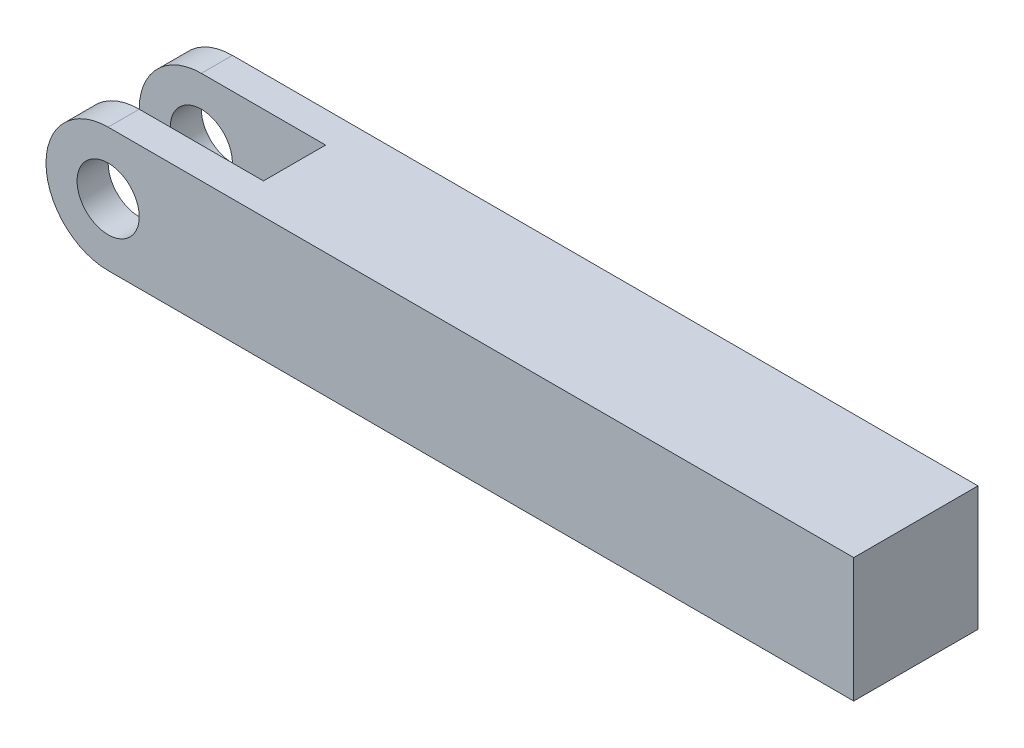
ISO-10303-21;
HEADER;
FILE_DESCRIPTION(('STEP AP214'),'2;1');
FILE_NAME('part.step','',(''),(''),'','','');
FILE_SCHEMA(('AUTOMOTIVE_DESIGN { 1 0 10303 214 1 1 1 1 }'));
ENDSEC;
DATA;
#1=APPLICATION_CONTEXT('core data for automotive mechanical design processes');
#2=APPLICATION_PROTOCOL_DEFINITION('international standard','automotive_design',2000,#1);
#3=PRODUCT_CONTEXT('',#1,'mechanical');
#4=PRODUCT('Part','Part','',(#3));
#5=PRODUCT_RELATED_PRODUCT_CATEGORY('part','',(#4));
#6=PRODUCT_DEFINITION_FORMATION('','',#4);
#7=PRODUCT_DEFINITION_CONTEXT('part definition',#1,'design');
#8=PRODUCT_DEFINITION('design','',#6,#7);
#9=PRODUCT_DEFINITION_SHAPE('','',#8);
#10=(LENGTH_UNIT() NAMED_UNIT(*) SI_UNIT(.MILLI.,.METRE.));
#11=(NAMED_UNIT(*) PLANE_ANGLE_UNIT() SI_UNIT($,.RADIAN.));
#12=(NAMED_UNIT(*) SI_UNIT($,.STERADIAN.) SOLID_ANGLE_UNIT());
#13=UNCERTAINTY_MEASURE_WITH_UNIT(LENGTH_MEASURE(1.E-05),#10,'distance_accuracy_value','');
#14=(GEOMETRIC_REPRESENTATION_CONTEXT(3) GLOBAL_UNCERTAINTY_ASSIGNED_CONTEXT((#13)) GLOBAL_UNIT_ASSIGNED_CONTEXT((#10,
#11,#12)) REPRESENTATION_CONTEXT('',''));
#15=CARTESIAN_POINT('',(0.,0.,0.));
#16=DIRECTION('',(0.,0.,1.));
#17=DIRECTION('',(1.,0.,0.));
#18=AXIS2_PLACEMENT_3D('',#15,#16,#17);
#19=CARTESIAN_POINT('',(-25.,-5.,5.));
#20=DIRECTION('',(1.,0.,0.));
#21=DIRECTION('',(0.,0.,-1.));
#22=AXIS2_PLACEMENT_3D('',#19,#20,#21);
#23=PLANE('',#22);
#24=DIRECTION('',(0.,-1.,0.));
#25=VECTOR('',#24,1.);
#26=CARTESIAN_POINT('',(-25.,-5.,2.5));
#27=LINE('',#26,#25);
#28=CARTESIAN_POINT('',(-25.,5.,2.5));
#29=VERTEX_POINT('',#28);
#30=CARTESIAN_POINT('',(-25.,-5.,2.5));
#31=VERTEX_POINT('',#30);
#32=EDGE_CURVE('E119',#29,#31,#27,.T.);
#33=ORIENTED_EDGE('',*,*,#32,.F.);
#34=DIRECTION('',(0.,0.,-1.));
#35=VECTOR('',#34,1.);
#36=CARTESIAN_POINT('',(-25.,5.,5.));
#37=LINE('',#36,#35);
#38=CARTESIAN_POINT('',(-25.,5.,-2.5));
#39=VERTEX_POINT('',#38);
#40=EDGE_CURVE('E50',#29,#39,#37,.T.);
#41=ORIENTED_EDGE('',*,*,#40,.T.);
#42=DIRECTION('',(0.,-1.,0.));
#43=VECTOR('',#42,1.);
#44=CARTESIAN_POINT('',(-25.,-5.,-2.5));
#45=LINE('',#44,#43);
#46=CARTESIAN_POINT('',(-25.,-5.,-2.5));
#47=VERTEX_POINT('',#46);
#48=EDGE_CURVE('E116',#39,#47,#45,.T.);
#49=ORIENTED_EDGE('',*,*,#48,.T.);
#50=DIRECTION('',(0.,0.,-1.));
#51=VECTOR('',#50,1.);
#52=CARTESIAN_POINT('',(-25.,-5.,5.));
#53=LINE('',#52,#51);
#54=EDGE_CURVE('E57',#31,#47,#53,.T.);
#55=ORIENTED_EDGE('',*,*,#54,.F.);
#56=EDGE_LOOP('',(#33,#41,#49,#55));
#57=FACE_BOUND('',#56,.T.);
#58=ADVANCED_FACE('F42',(#57),#23,.F.);
#59=CARTESIAN_POINT('',(25.,-5.,5.));
#60=DIRECTION('',(-1.,0.,0.));
#61=DIRECTION('',(0.,0.,1.));
#62=AXIS2_PLACEMENT_3D('',#59,#60,#61);
#63=PLANE('',#62);
#64=DIRECTION('',(0.,1.,0.));
#65=VECTOR('',#64,1.);
#66=CARTESIAN_POINT('',(25.,-5.,-5.));
#67=LINE('',#66,#65);
#68=CARTESIAN_POINT('',(25.,-5.,-5.));
#69=VERTEX_POINT('',#68);
#70=CARTESIAN_POINT('',(25.,5.,-5.));
#71=VERTEX_POINT('',#70);
#72=EDGE_CURVE('E97',#69,#71,#67,.T.);
#73=ORIENTED_EDGE('',*,*,#72,.T.);
#74=DIRECTION('',(0.,0.,-1.));
#75=VECTOR('',#74,1.);
#76=CARTESIAN_POINT('',(25.,5.,5.));
#77=LINE('',#76,#75);
#78=CARTESIAN_POINT('',(25.,5.,5.));
#79=VERTEX_POINT('',#78);
#80=EDGE_CURVE('E11',#79,#71,#77,.T.);
#81=ORIENTED_EDGE('',*,*,#80,.F.);
#82=DIRECTION('',(0.,1.,0.));
#83=VECTOR('',#82,1.);
#84=CARTESIAN_POINT('',(25.,-5.,5.));
#85=LINE('',#84,#83);
#86=CARTESIAN_POINT('',(25.,-5.,5.));
#87=VERTEX_POINT('',#86);
#88=EDGE_CURVE('E91',#87,#79,#85,.T.);
#89=ORIENTED_EDGE('',*,*,#88,.F.);
#90=DIRECTION('',(0.,0.,-1.));
#91=VECTOR('',#90,1.);
#92=CARTESIAN_POINT('',(25.,-5.,5.));
#93=LINE('',#92,#91);
#94=EDGE_CURVE('E82',#87,#69,#93,.T.);
#95=ORIENTED_EDGE('',*,*,#94,.T.);
#96=EDGE_LOOP('',(#73,#81,#89,#95));
#97=FACE_BOUND('',#96,.T.);
#98=ADVANCED_FACE('F44',(#97),#63,.F.);
#99=CARTESIAN_POINT('',(-25.,5.,5.));
#100=DIRECTION('',(0.,-1.,0.));
#101=DIRECTION('',(0.,0.,-1.));
#102=AXIS2_PLACEMENT_3D('',#99,#100,#101);
#103=PLANE('',#102);
#104=DIRECTION('',(-1.,0.,0.));
#105=VECTOR('',#104,1.);
#106=CARTESIAN_POINT('',(-25.,5.,-5.));
#107=LINE('',#106,#105);
#108=CARTESIAN_POINT('',(-35.,5.,-5.));
#109=VERTEX_POINT('',#108);
#110=EDGE_CURVE('E92',#71,#109,#107,.T.);
#111=ORIENTED_EDGE('',*,*,#110,.T.);
#112=DIRECTION('',(0.,0.,-1.));
#113=VECTOR('',#112,1.);
#114=CARTESIAN_POINT('',(-35.,5.,-2.5));
#115=LINE('',#114,#113);
#116=CARTESIAN_POINT('',(-35.,5.,-2.5));
#117=VERTEX_POINT('',#116);
#118=EDGE_CURVE('E102',#117,#109,#115,.T.);
#119=ORIENTED_EDGE('',*,*,#118,.F.);
#120=DIRECTION('',(1.,0.,0.));
#121=VECTOR('',#120,1.);
#122=CARTESIAN_POINT('',(-25.,5.,-2.5));
#123=LINE('',#122,#121);
#124=EDGE_CURVE('E129',#117,#39,#123,.T.);
#125=ORIENTED_EDGE('',*,*,#124,.T.);
#126=ORIENTED_EDGE('',*,*,#40,.F.);
#127=DIRECTION('',(1.,0.,0.));
#128=VECTOR('',#127,1.);
#129=CARTESIAN_POINT('',(-25.,5.,2.5));
#130=LINE('',#129,#128);
#131=CARTESIAN_POINT('',(-35.,5.,2.5));
#132=VERTEX_POINT('',#131);
#133=EDGE_CURVE('E166',#132,#29,#130,.T.);
#134=ORIENTED_EDGE('',*,*,#133,.F.);
#135=DIRECTION('',(0.,0.,1.));
#136=VECTOR('',#135,1.);
#137=CARTESIAN_POINT('',(-35.,5.,2.5));
#138=LINE('',#137,#136);
#139=CARTESIAN_POINT('',(-35.,5.,5.));
#140=VERTEX_POINT('',#139);
#141=EDGE_CURVE('E160',#132,#140,#138,.T.);
#142=ORIENTED_EDGE('',*,*,#141,.T.);
#143=DIRECTION('',(-1.,0.,0.));
#144=VECTOR('',#143,1.);
#145=CARTESIAN_POINT('',(-25.,5.,5.));
#146=LINE('',#145,#144);
#147=EDGE_CURVE('E144',#79,#140,#146,.T.);
#148=ORIENTED_EDGE('',*,*,#147,.F.);
#149=ORIENTED_EDGE('',*,*,#80,.T.);
#150=EDGE_LOOP('',(#111,#119,#125,#126,#134,#142,#148,#149));
#151=FACE_BOUND('',#150,.T.);
#152=ADVANCED_FACE('F134',(#151),#103,.F.);
#153=CARTESIAN_POINT('',(-25.,-5.,5.));
#154=DIRECTION('',(0.,1.,0.));
#155=DIRECTION('',(0.,0.,1.));
#156=AXIS2_PLACEMENT_3D('',#153,#154,#155);
#157=PLANE('',#156);
#158=DIRECTION('',(1.,0.,0.));
#159=VECTOR('',#158,1.);
#160=CARTESIAN_POINT('',(-25.,-5.,-5.));
#161=LINE('',#160,#159);
#162=CARTESIAN_POINT('',(-35.,-5.,-5.));
#163=VERTEX_POINT('',#162);
#164=EDGE_CURVE('E79',#163,#69,#161,.T.);
#165=ORIENTED_EDGE('',*,*,#164,.T.);
#166=ORIENTED_EDGE('',*,*,#94,.F.);
#167=DIRECTION('',(1.,0.,0.));
#168=VECTOR('',#167,1.);
#169=CARTESIAN_POINT('',(-25.,-5.,5.));
#170=LINE('',#169,#168);
#171=CARTESIAN_POINT('',(-35.,-5.,5.));
#172=VERTEX_POINT('',#171);
#173=EDGE_CURVE('E66',#172,#87,#170,.T.);
#174=ORIENTED_EDGE('',*,*,#173,.F.);
#175=DIRECTION('',(0.,0.,1.));
#176=VECTOR('',#175,1.);
#177=CARTESIAN_POINT('',(-35.,-5.,2.5));
#178=LINE('',#177,#176);
#179=CARTESIAN_POINT('',(-35.,-5.,2.5));
#180=VERTEX_POINT('',#179);
#181=EDGE_CURVE('E162',#180,#172,#178,.T.);
#182=ORIENTED_EDGE('',*,*,#181,.F.);
#183=DIRECTION('',(-1.,0.,0.));
#184=VECTOR('',#183,1.);
#185=CARTESIAN_POINT('',(-35.,-5.,2.5));
#186=LINE('',#185,#184);
#187=EDGE_CURVE('E167',#31,#180,#186,.T.);
#188=ORIENTED_EDGE('',*,*,#187,.F.);
#189=ORIENTED_EDGE('',*,*,#54,.T.);
#190=DIRECTION('',(-1.,0.,0.));
#191=VECTOR('',#190,1.);
#192=CARTESIAN_POINT('',(-35.,-5.,-2.5));
#193=LINE('',#192,#191);
#194=CARTESIAN_POINT('',(-35.,-5.,-2.5));
#195=VERTEX_POINT('',#194);
#196=EDGE_CURVE('E130',#47,#195,#193,.T.);
#197=ORIENTED_EDGE('',*,*,#196,.T.);
#198=DIRECTION('',(0.,0.,-1.));
#199=VECTOR('',#198,1.);
#200=CARTESIAN_POINT('',(-35.,-5.,-2.5));
#201=LINE('',#200,#199);
#202=EDGE_CURVE('E86',#195,#163,#201,.T.);
#203=ORIENTED_EDGE('',*,*,#202,.T.);
#204=EDGE_LOOP('',(#165,#166,#174,#182,#188,#189,#197,#203));
#205=FACE_BOUND('',#204,.T.);
#206=ADVANCED_FACE('F81',(#205),#157,.F.);
#207=CARTESIAN_POINT('',(0.,0.,5.));
#208=DIRECTION('',(0.,0.,-1.));
#209=DIRECTION('',(-1.,0.,0.));
#210=AXIS2_PLACEMENT_3D('',#207,#208,#209);
#211=PLANE('',#210);
#212=ORIENTED_EDGE('',*,*,#88,.T.);
#213=ORIENTED_EDGE('',*,*,#147,.T.);
#214=CARTESIAN_POINT('',(-35.,0.,5.));
#215=DIRECTION('',(0.,0.,-1.));
#216=DIRECTION('',(-1.,0.,0.));
#217=AXIS2_PLACEMENT_3D('',#214,#215,#216);
#218=CIRCLE('',#217,5.);
#219=EDGE_CURVE('E151',#172,#140,#218,.T.);
#220=ORIENTED_EDGE('',*,*,#219,.F.);
#221=ORIENTED_EDGE('',*,*,#173,.T.);
#222=EDGE_LOOP('',(#212,#213,#220,#221));
#223=FACE_BOUND('',#222,.T.);
#224=CARTESIAN_POINT('',(-35.,0.,5.));
#225=DIRECTION('',(0.,0.,-1.));
#226=DIRECTION('',(-1.,0.,0.));
#227=AXIS2_PLACEMENT_3D('',#224,#225,#226);
#228=CIRCLE('',#227,2.49999999999999);
#229=CARTESIAN_POINT('',(-37.5,0.,5.));
#230=VERTEX_POINT('',#229);
#231=EDGE_CURVE('E197',#230,#230,#228,.T.);
#232=ORIENTED_EDGE('',*,*,#231,.T.);
#233=EDGE_LOOP('',(#232));
#234=FACE_BOUND('',#233,.T.);
#235=ADVANCED_FACE('F148',(#223,#234),#211,.F.);
#236=CARTESIAN_POINT('',(0.,0.,-5.));
#237=DIRECTION('',(0.,0.,-1.));
#238=DIRECTION('',(-1.,0.,0.));
#239=AXIS2_PLACEMENT_3D('',#236,#237,#238);
#240=PLANE('',#239);
#241=ORIENTED_EDGE('',*,*,#72,.F.);
#242=ORIENTED_EDGE('',*,*,#164,.F.);
#243=CARTESIAN_POINT('',(-35.,0.,-5.));
#244=DIRECTION('',(0.,0.,-1.));
#245=DIRECTION('',(-1.,0.,0.));
#246=AXIS2_PLACEMENT_3D('',#243,#244,#245);
#247=CIRCLE('',#246,5.);
#248=EDGE_CURVE('E131',#163,#109,#247,.T.);
#249=ORIENTED_EDGE('',*,*,#248,.T.);
#250=ORIENTED_EDGE('',*,*,#110,.F.);
#251=EDGE_LOOP('',(#241,#242,#249,#250));
#252=FACE_BOUND('',#251,.T.);
#253=CARTESIAN_POINT('',(-35.,0.,-5.));
#254=DIRECTION('',(0.,0.,-1.));
#255=DIRECTION('',(-1.,0.,0.));
#256=AXIS2_PLACEMENT_3D('',#253,#254,#255);
#257=CIRCLE('',#256,2.49999999999999);
#258=CARTESIAN_POINT('',(-37.5,0.,-5.));
#259=VERTEX_POINT('',#258);
#260=EDGE_CURVE('E169',#259,#259,#257,.T.);
#261=ORIENTED_EDGE('',*,*,#260,.F.);
#262=EDGE_LOOP('',(#261));
#263=FACE_BOUND('',#262,.T.);
#264=ADVANCED_FACE('F99',(#252,#263),#240,.T.);
#265=CARTESIAN_POINT('',(-35.,0.,-2.5));
#266=DIRECTION('',(0.,0.,-1.));
#267=DIRECTION('',(-1.,0.,0.));
#268=AXIS2_PLACEMENT_3D('',#265,#266,#267);
#269=CYLINDRICAL_SURFACE('',#268,5.);
#270=ORIENTED_EDGE('',*,*,#248,.F.);
#271=ORIENTED_EDGE('',*,*,#202,.F.);
#272=CARTESIAN_POINT('',(-35.,0.,-2.5));
#273=DIRECTION('',(0.,0.,-1.));
#274=DIRECTION('',(-1.,0.,0.));
#275=AXIS2_PLACEMENT_3D('',#272,#273,#274);
#276=CIRCLE('',#275,5.);
#277=EDGE_CURVE('E136',#195,#117,#276,.T.);
#278=ORIENTED_EDGE('',*,*,#277,.T.);
#279=ORIENTED_EDGE('',*,*,#118,.T.);
#280=EDGE_LOOP('',(#270,#271,#278,#279));
#281=FACE_BOUND('',#280,.T.);
#282=ADVANCED_FACE('F236',(#281),#269,.T.);
#283=CARTESIAN_POINT('',(-35.,0.,-2.5));
#284=DIRECTION('',(0.,0.,-1.));
#285=DIRECTION('',(-1.,0.,0.));
#286=AXIS2_PLACEMENT_3D('',#283,#284,#285);
#287=PLANE('',#286);
#288=CARTESIAN_POINT('',(-35.,0.,-2.5));
#289=DIRECTION('',(0.,0.,-1.));
#290=DIRECTION('',(-1.,0.,0.));
#291=AXIS2_PLACEMENT_3D('',#288,#289,#290);
#292=CIRCLE('',#291,2.49999999999999);
#293=CARTESIAN_POINT('',(-37.5,0.,-2.5));
#294=VERTEX_POINT('',#293);
#295=EDGE_CURVE('E142',#294,#294,#292,.T.);
#296=ORIENTED_EDGE('',*,*,#295,.T.);
#297=EDGE_LOOP('',(#296));
#298=FACE_BOUND('',#297,.T.);
#299=ORIENTED_EDGE('',*,*,#48,.F.);
#300=ORIENTED_EDGE('',*,*,#124,.F.);
#301=ORIENTED_EDGE('',*,*,#277,.F.);
#302=ORIENTED_EDGE('',*,*,#196,.F.);
#303=EDGE_LOOP('',(#299,#300,#301,#302));
#304=FACE_BOUND('',#303,.T.);
#305=ADVANCED_FACE('F127',(#298,#304),#287,.F.);
#306=CARTESIAN_POINT('',(-35.,0.,-2.5));
#307=DIRECTION('',(0.,0.,-1.));
#308=DIRECTION('',(-1.,0.,0.));
#309=AXIS2_PLACEMENT_3D('',#306,#307,#308);
#310=CYLINDRICAL_SURFACE('',#309,2.49999999999999);
#311=ORIENTED_EDGE('',*,*,#295,.F.);
#312=EDGE_LOOP('',(#311));
#313=FACE_BOUND('',#312,.T.);
#314=ORIENTED_EDGE('',*,*,#260,.T.);
#315=EDGE_LOOP('',(#314));
#316=FACE_BOUND('',#315,.T.);
#317=ADVANCED_FACE('F208',(#313,#316),#310,.F.);
#318=CARTESIAN_POINT('',(-35.,0.,2.5));
#319=DIRECTION('',(0.,0.,1.));
#320=DIRECTION('',(-1.,0.,0.));
#321=AXIS2_PLACEMENT_3D('',#318,#319,#320);
#322=PLANE('',#321);
#323=ORIENTED_EDGE('',*,*,#32,.T.);
#324=ORIENTED_EDGE('',*,*,#187,.T.);
#325=CARTESIAN_POINT('',(-35.,0.,2.5));
#326=DIRECTION('',(0.,0.,-1.));
#327=DIRECTION('',(-1.,0.,0.));
#328=AXIS2_PLACEMENT_3D('',#325,#326,#327);
#329=CIRCLE('',#328,5.);
#330=EDGE_CURVE('E172',#180,#132,#329,.T.);
#331=ORIENTED_EDGE('',*,*,#330,.T.);
#332=ORIENTED_EDGE('',*,*,#133,.T.);
#333=EDGE_LOOP('',(#323,#324,#331,#332));
#334=FACE_BOUND('',#333,.T.);
#335=CARTESIAN_POINT('',(-35.,0.,2.5));
#336=DIRECTION('',(0.,0.,-1.));
#337=DIRECTION('',(-1.,0.,0.));
#338=AXIS2_PLACEMENT_3D('',#335,#336,#337);
#339=CIRCLE('',#338,2.49999999999999);
#340=CARTESIAN_POINT('',(-37.5,0.,2.5));
#341=VERTEX_POINT('',#340);
#342=EDGE_CURVE('E163',#341,#341,#339,.T.);
#343=ORIENTED_EDGE('',*,*,#342,.F.);
#344=EDGE_LOOP('',(#343));
#345=FACE_BOUND('',#344,.T.);
#346=ADVANCED_FACE('F206',(#334,#345),#322,.F.);
#347=CARTESIAN_POINT('',(-35.,0.,2.5));
#348=DIRECTION('',(0.,0.,1.));
#349=DIRECTION('',(1.,0.,0.));
#350=AXIS2_PLACEMENT_3D('',#347,#348,#349);
#351=CYLINDRICAL_SURFACE('',#350,5.);
#352=ORIENTED_EDGE('',*,*,#219,.T.);
#353=ORIENTED_EDGE('',*,*,#141,.F.);
#354=ORIENTED_EDGE('',*,*,#330,.F.);
#355=ORIENTED_EDGE('',*,*,#181,.T.);
#356=EDGE_LOOP('',(#352,#353,#354,#355));
#357=FACE_BOUND('',#356,.T.);
#358=ADVANCED_FACE('F157',(#357),#351,.T.);
#359=CARTESIAN_POINT('',(-35.,0.,2.5));
#360=DIRECTION('',(0.,0.,1.));
#361=DIRECTION('',(1.,0.,0.));
#362=AXIS2_PLACEMENT_3D('',#359,#360,#361);
#363=CYLINDRICAL_SURFACE('',#362,2.49999999999999);
#364=ORIENTED_EDGE('',*,*,#342,.T.);
#365=EDGE_LOOP('',(#364));
#366=FACE_BOUND('',#365,.T.);
#367=ORIENTED_EDGE('',*,*,#231,.F.);
#368=EDGE_LOOP('',(#367));
#369=FACE_BOUND('',#368,.T.);
#370=ADVANCED_FACE('F203',(#366,#369),#363,.F.);
#371=CLOSED_SHELL('',(#58,#98,#152,#206,#235,#264,#282,#305,#317,#346,#358,#370));
#372=MANIFOLD_SOLID_BREP('B2',#371);
#373=ADVANCED_BREP_SHAPE_REPRESENTATION('',(#18,#372),#14);
#374=SHAPE_DEFINITION_REPRESENTATION(#9,#373);
ENDSEC;
END-ISO-10303-21;
